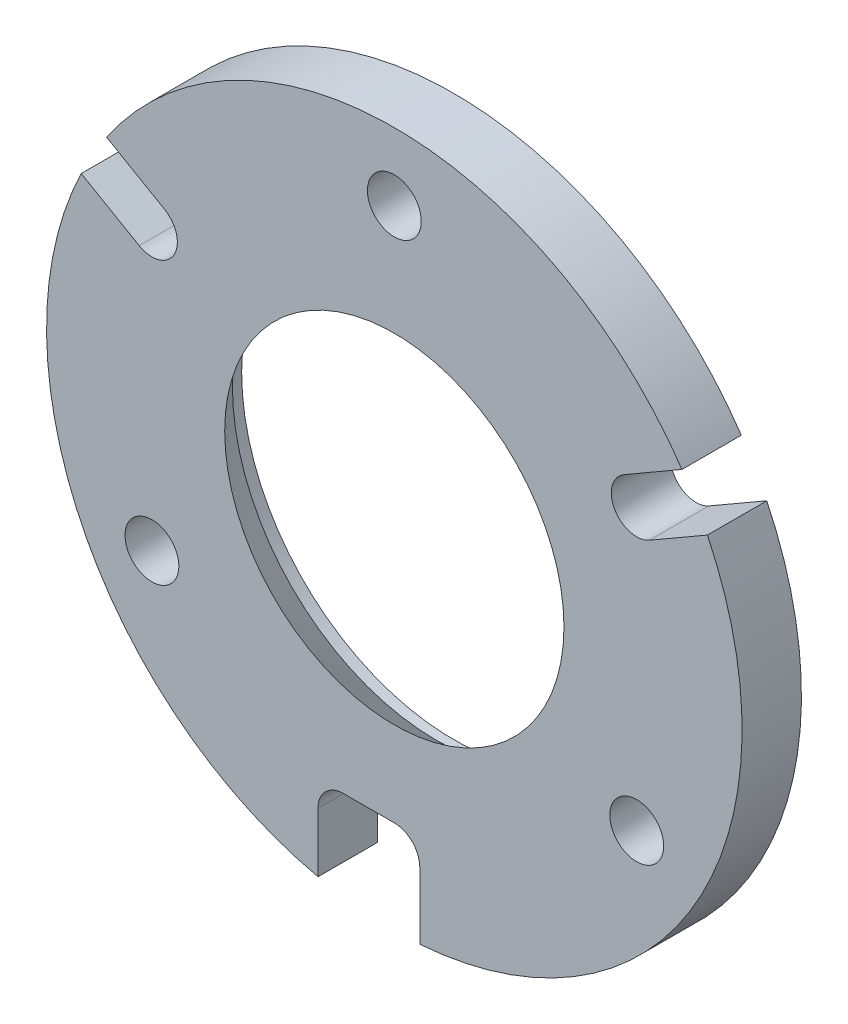
ISO-10303-21;
HEADER;
FILE_DESCRIPTION(('STEP AP214'),'2;1');
FILE_NAME('part.step','',(''),(''),'','','');
FILE_SCHEMA(('AUTOMOTIVE_DESIGN { 1 0 10303 214 1 1 1 1 }'));
ENDSEC;
DATA;
#1=APPLICATION_CONTEXT('core data for automotive mechanical design processes');
#2=APPLICATION_PROTOCOL_DEFINITION('international standard','automotive_design',2000,#1);
#3=PRODUCT_CONTEXT('',#1,'mechanical');
#4=PRODUCT('Part','Part','',(#3));
#5=PRODUCT_RELATED_PRODUCT_CATEGORY('part','',(#4));
#6=PRODUCT_DEFINITION_FORMATION('','',#4);
#7=PRODUCT_DEFINITION_CONTEXT('part definition',#1,'design');
#8=PRODUCT_DEFINITION('design','',#6,#7);
#9=PRODUCT_DEFINITION_SHAPE('','',#8);
#10=(LENGTH_UNIT() NAMED_UNIT(*) SI_UNIT(.MILLI.,.METRE.));
#11=(NAMED_UNIT(*) PLANE_ANGLE_UNIT() SI_UNIT($,.RADIAN.));
#12=(NAMED_UNIT(*) SI_UNIT($,.STERADIAN.) SOLID_ANGLE_UNIT());
#13=UNCERTAINTY_MEASURE_WITH_UNIT(LENGTH_MEASURE(1.E-05),#10,'distance_accuracy_value','');
#14=(GEOMETRIC_REPRESENTATION_CONTEXT(3) GLOBAL_UNCERTAINTY_ASSIGNED_CONTEXT((#13)) GLOBAL_UNIT_ASSIGNED_CONTEXT((#10,
#11,#12)) REPRESENTATION_CONTEXT('',''));
#15=CARTESIAN_POINT('',(0.,0.,0.));
#16=DIRECTION('',(0.,0.,1.));
#17=DIRECTION('',(1.,0.,0.));
#18=AXIS2_PLACEMENT_3D('',#15,#16,#17);
#19=CARTESIAN_POINT('',(0.,0.,5.));
#20=DIRECTION('',(0.,0.,-1.));
#21=DIRECTION('',(-1.,0.,0.));
#22=AXIS2_PLACEMENT_3D('',#19,#20,#21);
#23=CYLINDRICAL_SURFACE('',#22,12.5);
#24=CARTESIAN_POINT('',(0.,0.,1.5));
#25=DIRECTION('',(0.,0.,1.));
#26=DIRECTION('',(1.,0.,0.));
#27=AXIS2_PLACEMENT_3D('',#24,#25,#26);
#28=CIRCLE('',#27,12.5);
#29=CARTESIAN_POINT('',(12.5,0.,1.5));
#30=VERTEX_POINT('',#29);
#31=EDGE_CURVE('E206',#30,#30,#28,.T.);
#32=ORIENTED_EDGE('',*,*,#31,.F.);
#33=EDGE_LOOP('',(#32));
#34=FACE_BOUND('',#33,.T.);
#35=CARTESIAN_POINT('',(0.,0.,2.5));
#36=DIRECTION('',(0.,0.,-1.));
#37=DIRECTION('',(-1.,0.,0.));
#38=AXIS2_PLACEMENT_3D('',#35,#36,#37);
#39=CIRCLE('',#38,12.5);
#40=CARTESIAN_POINT('',(-12.5,0.,2.5));
#41=VERTEX_POINT('',#40);
#42=EDGE_CURVE('E209',#41,#41,#39,.T.);
#43=ORIENTED_EDGE('',*,*,#42,.F.);
#44=EDGE_LOOP('',(#43));
#45=FACE_BOUND('',#44,.T.);
#46=ADVANCED_FACE('F40',(#34,#45),#23,.F.);
#47=CARTESIAN_POINT('',(0.,0.,5.));
#48=DIRECTION('',(0.,0.,1.));
#49=DIRECTION('',(1.,0.,0.));
#50=AXIS2_PLACEMENT_3D('',#47,#48,#49);
#51=PLANE('',#50);
#52=DIRECTION('',(-1.,0.,0.));
#53=VECTOR('',#52,1.);
#54=CARTESIAN_POINT('',(0.,-15.,5.));
#55=LINE('',#54,#53);
#56=CARTESIAN_POINT('',(0.,-15.,5.));
#57=VERTEX_POINT('',#56);
#58=CARTESIAN_POINT('',(-3.,-15.,5.));
#59=VERTEX_POINT('',#58);
#60=EDGE_CURVE('E146',#57,#59,#55,.T.);
#61=ORIENTED_EDGE('',*,*,#60,.F.);
#62=CARTESIAN_POINT('',(0.,-16.5,5.));
#63=DIRECTION('',(0.,0.,1.));
#64=DIRECTION('',(1.,0.,0.));
#65=AXIS2_PLACEMENT_3D('',#62,#63,#64);
#66=CIRCLE('',#65,1.5);
#67=CARTESIAN_POINT('',(1.5,-16.5,5.));
#68=VERTEX_POINT('',#67);
#69=EDGE_CURVE('E249',#68,#57,#66,.T.);
#70=ORIENTED_EDGE('',*,*,#69,.F.);
#71=DIRECTION('',(0.,-1.,0.));
#72=VECTOR('',#71,1.);
#73=CARTESIAN_POINT('',(1.5,-45.2414213562373,5.));
#74=LINE('',#73,#72);
#75=CARTESIAN_POINT('',(1.5,-20.4450483002609,5.));
#76=VERTEX_POINT('',#75);
#77=EDGE_CURVE('E241',#68,#76,#74,.T.);
#78=ORIENTED_EDGE('',*,*,#77,.T.);
#79=CARTESIAN_POINT('',(0.,0.,5.));
#80=DIRECTION('',(0.,0.,1.));
#81=DIRECTION('',(1.,0.,0.));
#82=AXIS2_PLACEMENT_3D('',#79,#80,#81);
#83=CIRCLE('',#82,20.5);
#84=CARTESIAN_POINT('',(18.4559312096259,8.92348604445361,5.));
#85=VERTEX_POINT('',#84);
#86=EDGE_CURVE('E48',#76,#85,#83,.T.);
#87=ORIENTED_EDGE('',*,*,#86,.T.);
#88=DIRECTION('',(0.866025403784443,0.499999999999992,0.));
#89=VECTOR('',#88,1.);
#90=CARTESIAN_POINT('',(39.9302201978175,21.3216725724416,5.));
#91=LINE('',#90,#89);
#92=CARTESIAN_POINT('',(15.0394191624433,6.9509618943232,5.));
#93=VERTEX_POINT('',#92);
#94=EDGE_CURVE('E218',#93,#85,#91,.T.);
#95=ORIENTED_EDGE('',*,*,#94,.F.);
#96=CARTESIAN_POINT('',(14.2894191624433,8.24999999999987,5.));
#97=DIRECTION('',(0.,0.,1.));
#98=DIRECTION('',(-0.499999999999992,0.866025403784443,0.));
#99=AXIS2_PLACEMENT_3D('',#96,#97,#98);
#100=CIRCLE('',#99,1.5);
#101=CARTESIAN_POINT('',(13.5394191624433,9.54903810567653,5.));
#102=VERTEX_POINT('',#101);
#103=EDGE_CURVE('E215',#102,#93,#100,.T.);
#104=ORIENTED_EDGE('',*,*,#103,.F.);
#105=DIRECTION('',(0.866025403784443,0.499999999999992,0.));
#106=VECTOR('',#105,1.);
#107=CARTESIAN_POINT('',(38.4302201978176,23.919748783795,5.));
#108=LINE('',#107,#106);
#109=CARTESIAN_POINT('',(16.9559312096259,11.5215622558069,5.));
#110=VERTEX_POINT('',#109);
#111=EDGE_CURVE('E212',#102,#110,#108,.T.);
#112=ORIENTED_EDGE('',*,*,#111,.T.);
#113=CARTESIAN_POINT('',(-16.9559312096257,11.5215622558072,5.));
#114=VERTEX_POINT('',#113);
#115=EDGE_CURVE('E266',#110,#114,#83,.T.);
#116=ORIENTED_EDGE('',*,*,#115,.T.);
#117=DIRECTION('',(-0.866025403784436,0.500000000000004,0.));
#118=VECTOR('',#117,1.);
#119=CARTESIAN_POINT('',(-38.4302201978172,23.9197487837955,5.));
#120=LINE('',#119,#118);
#121=CARTESIAN_POINT('',(-13.5394191624432,9.54903810567672,5.));
#122=VERTEX_POINT('',#121);
#123=EDGE_CURVE('E235',#122,#114,#120,.T.);
#124=ORIENTED_EDGE('',*,*,#123,.F.);
#125=CARTESIAN_POINT('',(-14.2894191624432,8.25000000000007,5.));
#126=DIRECTION('',(0.,0.,1.));
#127=DIRECTION('',(-0.500000000000004,-0.866025403784436,0.));
#128=AXIS2_PLACEMENT_3D('',#125,#126,#127);
#129=CIRCLE('',#128,1.5);
#130=CARTESIAN_POINT('',(-15.0394191624432,6.95096189432341,5.));
#131=VERTEX_POINT('',#130);
#132=EDGE_CURVE('E232',#131,#122,#129,.T.);
#133=ORIENTED_EDGE('',*,*,#132,.F.);
#134=DIRECTION('',(-0.866025403784436,0.500000000000004,0.));
#135=VECTOR('',#134,1.);
#136=CARTESIAN_POINT('',(-39.9302201978172,21.3216725724422,5.));
#137=LINE('',#136,#135);
#138=CARTESIAN_POINT('',(-18.4559312096257,8.92348604445386,5.));
#139=VERTEX_POINT('',#138);
#140=EDGE_CURVE('E224',#131,#139,#137,.T.);
#141=ORIENTED_EDGE('',*,*,#140,.T.);
#142=CARTESIAN_POINT('',(-4.5,-20.,5.));
#143=VERTEX_POINT('',#142);
#144=EDGE_CURVE('E264',#139,#143,#83,.T.);
#145=ORIENTED_EDGE('',*,*,#144,.T.);
#146=DIRECTION('',(0.,-1.,0.));
#147=VECTOR('',#146,1.);
#148=CARTESIAN_POINT('',(-4.5,-45.183732205308,5.));
#149=LINE('',#148,#147);
#150=CARTESIAN_POINT('',(-4.5,-16.5,5.));
#151=VERTEX_POINT('',#150);
#152=EDGE_CURVE('E161',#151,#143,#149,.T.);
#153=ORIENTED_EDGE('',*,*,#152,.F.);
#154=CARTESIAN_POINT('',(-3.,-16.5,5.));
#155=DIRECTION('',(0.,0.,1.));
#156=DIRECTION('',(1.,0.,0.));
#157=AXIS2_PLACEMENT_3D('',#154,#155,#156);
#158=CIRCLE('',#157,1.5);
#159=EDGE_CURVE('E163',#59,#151,#158,.T.);
#160=ORIENTED_EDGE('',*,*,#159,.F.);
#161=EDGE_LOOP('',(#61,#70,#78,#87,#95,#104,#112,#116,#124,#133,#141,#145,#153,#160));
#162=FACE_BOUND('',#161,.T.);
#163=CARTESIAN_POINT('',(-14.2894191624432,-8.25,5.));
#164=DIRECTION('',(0.,0.,1.));
#165=DIRECTION('',(1.,0.,0.));
#166=AXIS2_PLACEMENT_3D('',#163,#164,#165);
#167=CIRCLE('',#166,1.5875);
#168=CARTESIAN_POINT('',(-12.7019191624432,-8.25,5.));
#169=VERTEX_POINT('',#168);
#170=EDGE_CURVE('E255',#169,#169,#167,.T.);
#171=ORIENTED_EDGE('',*,*,#170,.F.);
#172=EDGE_LOOP('',(#171));
#173=FACE_BOUND('',#172,.T.);
#174=CARTESIAN_POINT('',(0.,16.5,5.));
#175=DIRECTION('',(0.,0.,1.));
#176=DIRECTION('',(1.,0.,0.));
#177=AXIS2_PLACEMENT_3D('',#174,#175,#176);
#178=CIRCLE('',#177,1.5875);
#179=CARTESIAN_POINT('',(1.5875,16.5,5.));
#180=VERTEX_POINT('',#179);
#181=EDGE_CURVE('E262',#180,#180,#178,.T.);
#182=ORIENTED_EDGE('',*,*,#181,.F.);
#183=EDGE_LOOP('',(#182));
#184=FACE_BOUND('',#183,.T.);
#185=CARTESIAN_POINT('',(14.2894191624432,-8.25,5.));
#186=DIRECTION('',(0.,0.,1.));
#187=DIRECTION('',(1.,0.,0.));
#188=AXIS2_PLACEMENT_3D('',#185,#186,#187);
#189=CIRCLE('',#188,1.5875);
#190=CARTESIAN_POINT('',(15.8769191624432,-8.25,5.));
#191=VERTEX_POINT('',#190);
#192=EDGE_CURVE('E259',#191,#191,#189,.T.);
#193=ORIENTED_EDGE('',*,*,#192,.F.);
#194=EDGE_LOOP('',(#193));
#195=FACE_BOUND('',#194,.T.);
#196=CARTESIAN_POINT('',(0.,0.,5.));
#197=DIRECTION('',(0.,0.,-1.));
#198=DIRECTION('',(-1.,0.,0.));
#199=AXIS2_PLACEMENT_3D('',#196,#197,#198);
#200=CIRCLE('',#199,10.);
#201=CARTESIAN_POINT('',(-10.,0.,5.));
#202=VERTEX_POINT('',#201);
#203=EDGE_CURVE('E361',#202,#202,#200,.T.);
#204=ORIENTED_EDGE('',*,*,#203,.T.);
#205=EDGE_LOOP('',(#204));
#206=FACE_BOUND('',#205,.T.);
#207=ADVANCED_FACE('F274',(#162,#173,#184,#195,#206),#51,.T.);
#208=CARTESIAN_POINT('',(0.,0.,5.));
#209=DIRECTION('',(0.,0.,-1.));
#210=DIRECTION('',(-1.,0.,0.));
#211=AXIS2_PLACEMENT_3D('',#208,#209,#210);
#212=CYLINDRICAL_SURFACE('',#211,20.5);
#213=DIRECTION('',(0.,0.,1.));
#214=VECTOR('',#213,1.);
#215=CARTESIAN_POINT('',(16.9559312096259,11.5215622558069,0.));
#216=LINE('',#215,#214);
#217=CARTESIAN_POINT('',(16.9559312096259,11.5215622558069,1.5));
#218=VERTEX_POINT('',#217);
#219=EDGE_CURVE('E222',#218,#110,#216,.T.);
#220=ORIENTED_EDGE('',*,*,#219,.F.);
#221=CARTESIAN_POINT('',(0.,0.,1.5));
#222=DIRECTION('',(0.,0.,-1.));
#223=DIRECTION('',(-1.,0.,0.));
#224=AXIS2_PLACEMENT_3D('',#221,#222,#223);
#225=CIRCLE('',#224,20.5);
#226=CARTESIAN_POINT('',(-16.9559312096257,11.5215622558072,1.5));
#227=VERTEX_POINT('',#226);
#228=EDGE_CURVE('E181',#227,#218,#225,.T.);
#229=ORIENTED_EDGE('',*,*,#228,.F.);
#230=DIRECTION('',(0.,0.,1.));
#231=VECTOR('',#230,1.);
#232=CARTESIAN_POINT('',(-16.9559312096257,11.5215622558072,0.));
#233=LINE('',#232,#231);
#234=EDGE_CURVE('E242',#227,#114,#233,.T.);
#235=ORIENTED_EDGE('',*,*,#234,.T.);
#236=ORIENTED_EDGE('',*,*,#115,.F.);
#237=EDGE_LOOP('',(#220,#229,#235,#236));
#238=FACE_BOUND('',#237,.T.);
#239=ADVANCED_FACE('F298',(#238),#212,.T.);
#240=CARTESIAN_POINT('',(-4.5,-20.,1.5));
#241=VERTEX_POINT('',#240);
#242=CARTESIAN_POINT('',(-18.4559312096257,8.92348604445387,1.5));
#243=VERTEX_POINT('',#242);
#244=EDGE_CURVE('E174',#241,#243,#225,.T.);
#245=ORIENTED_EDGE('',*,*,#244,.F.);
#246=DIRECTION('',(0.,0.,1.));
#247=VECTOR('',#246,1.);
#248=CARTESIAN_POINT('',(-4.5,-20.,1.5));
#249=LINE('',#248,#247);
#250=EDGE_CURVE('E175',#241,#143,#249,.T.);
#251=ORIENTED_EDGE('',*,*,#250,.T.);
#252=ORIENTED_EDGE('',*,*,#144,.F.);
#253=DIRECTION('',(0.,0.,1.));
#254=VECTOR('',#253,1.);
#255=CARTESIAN_POINT('',(-18.4559312096257,8.92348604445386,0.));
#256=LINE('',#255,#254);
#257=EDGE_CURVE('E239',#243,#139,#256,.T.);
#258=ORIENTED_EDGE('',*,*,#257,.F.);
#259=EDGE_LOOP('',(#245,#251,#252,#258));
#260=FACE_BOUND('',#259,.T.);
#261=ADVANCED_FACE('F281',(#260),#212,.T.);
#262=DIRECTION('',(0.,0.,1.));
#263=VECTOR('',#262,1.);
#264=CARTESIAN_POINT('',(1.5,-20.4450483002609,0.));
#265=LINE('',#264,#263);
#266=CARTESIAN_POINT('',(1.5,-20.4450483002609,1.5));
#267=VERTEX_POINT('',#266);
#268=EDGE_CURVE('E253',#267,#76,#265,.T.);
#269=ORIENTED_EDGE('',*,*,#268,.F.);
#270=CARTESIAN_POINT('',(18.4559312096259,8.92348604445361,1.5));
#271=VERTEX_POINT('',#270);
#272=EDGE_CURVE('E180',#271,#267,#225,.T.);
#273=ORIENTED_EDGE('',*,*,#272,.F.);
#274=DIRECTION('',(0.,0.,1.));
#275=VECTOR('',#274,1.);
#276=CARTESIAN_POINT('',(18.4559312096259,8.92348604445361,0.));
#277=LINE('',#276,#275);
#278=EDGE_CURVE('E225',#271,#85,#277,.T.);
#279=ORIENTED_EDGE('',*,*,#278,.T.);
#280=ORIENTED_EDGE('',*,*,#86,.F.);
#281=EDGE_LOOP('',(#269,#273,#279,#280));
#282=FACE_BOUND('',#281,.T.);
#283=ADVANCED_FACE('F42',(#282),#212,.T.);
#284=CARTESIAN_POINT('',(0.,16.5,5.));
#285=DIRECTION('',(0.,0.,-1.));
#286=DIRECTION('',(-1.,0.,0.));
#287=AXIS2_PLACEMENT_3D('',#284,#285,#286);
#288=CYLINDRICAL_SURFACE('',#287,1.5875);
#289=CARTESIAN_POINT('',(0.,16.5,1.5));
#290=DIRECTION('',(0.,0.,1.));
#291=DIRECTION('',(1.,0.,0.));
#292=AXIS2_PLACEMENT_3D('',#289,#290,#291);
#293=CIRCLE('',#292,1.5875);
#294=CARTESIAN_POINT('',(1.5875,16.5,1.5));
#295=VERTEX_POINT('',#294);
#296=EDGE_CURVE('E203',#295,#295,#293,.T.);
#297=ORIENTED_EDGE('',*,*,#296,.F.);
#298=EDGE_LOOP('',(#297));
#299=FACE_BOUND('',#298,.T.);
#300=ORIENTED_EDGE('',*,*,#181,.T.);
#301=EDGE_LOOP('',(#300));
#302=FACE_BOUND('',#301,.T.);
#303=ADVANCED_FACE('F339',(#299,#302),#288,.F.);
#304=CARTESIAN_POINT('',(14.2894191624432,-8.25,5.));
#305=DIRECTION('',(0.,0.,-1.));
#306=DIRECTION('',(-1.,0.,0.));
#307=AXIS2_PLACEMENT_3D('',#304,#305,#306);
#308=CYLINDRICAL_SURFACE('',#307,1.5875);
#309=CARTESIAN_POINT('',(14.2894191624432,-8.25,1.5));
#310=DIRECTION('',(0.,0.,1.));
#311=DIRECTION('',(1.,0.,0.));
#312=AXIS2_PLACEMENT_3D('',#309,#310,#311);
#313=CIRCLE('',#312,1.5875);
#314=CARTESIAN_POINT('',(15.8769191624432,-8.25,1.5));
#315=VERTEX_POINT('',#314);
#316=EDGE_CURVE('E200',#315,#315,#313,.T.);
#317=ORIENTED_EDGE('',*,*,#316,.F.);
#318=EDGE_LOOP('',(#317));
#319=FACE_BOUND('',#318,.T.);
#320=ORIENTED_EDGE('',*,*,#192,.T.);
#321=EDGE_LOOP('',(#320));
#322=FACE_BOUND('',#321,.T.);
#323=ADVANCED_FACE('F342',(#319,#322),#308,.F.);
#324=CARTESIAN_POINT('',(-14.2894191624432,-8.25,5.));
#325=DIRECTION('',(0.,0.,-1.));
#326=DIRECTION('',(-1.,0.,0.));
#327=AXIS2_PLACEMENT_3D('',#324,#325,#326);
#328=CYLINDRICAL_SURFACE('',#327,1.5875);
#329=CARTESIAN_POINT('',(-14.2894191624432,-8.25,1.5));
#330=DIRECTION('',(0.,0.,1.));
#331=DIRECTION('',(1.,0.,0.));
#332=AXIS2_PLACEMENT_3D('',#329,#330,#331);
#333=CIRCLE('',#332,1.5875);
#334=CARTESIAN_POINT('',(-12.7019191624432,-8.25,1.5));
#335=VERTEX_POINT('',#334);
#336=EDGE_CURVE('E197',#335,#335,#333,.T.);
#337=ORIENTED_EDGE('',*,*,#336,.F.);
#338=EDGE_LOOP('',(#337));
#339=FACE_BOUND('',#338,.T.);
#340=ORIENTED_EDGE('',*,*,#170,.T.);
#341=EDGE_LOOP('',(#340));
#342=FACE_BOUND('',#341,.T.);
#343=ADVANCED_FACE('F328',(#339,#342),#328,.F.);
#344=CARTESIAN_POINT('',(1.5,-45.2414213562373,0.));
#345=DIRECTION('',(-1.,0.,0.));
#346=DIRECTION('',(0.,0.,1.));
#347=AXIS2_PLACEMENT_3D('',#344,#345,#346);
#348=PLANE('',#347);
#349=DIRECTION('',(0.,1.,0.));
#350=VECTOR('',#349,1.);
#351=CARTESIAN_POINT('',(1.5,-45.2414213562373,1.5));
#352=LINE('',#351,#350);
#353=CARTESIAN_POINT('',(1.5,-16.5,1.5));
#354=VERTEX_POINT('',#353);
#355=EDGE_CURVE('E195',#267,#354,#352,.T.);
#356=ORIENTED_EDGE('',*,*,#355,.F.);
#357=ORIENTED_EDGE('',*,*,#268,.T.);
#358=ORIENTED_EDGE('',*,*,#77,.F.);
#359=DIRECTION('',(0.,0.,1.));
#360=VECTOR('',#359,1.);
#361=CARTESIAN_POINT('',(1.5,-16.5,0.));
#362=LINE('',#361,#360);
#363=EDGE_CURVE('E252',#354,#68,#362,.T.);
#364=ORIENTED_EDGE('',*,*,#363,.F.);
#365=EDGE_LOOP('',(#356,#357,#358,#364));
#366=FACE_BOUND('',#365,.T.);
#367=ADVANCED_FACE('F316',(#366),#348,.T.);
#368=CARTESIAN_POINT('',(0.,-16.5,0.));
#369=DIRECTION('',(0.,0.,1.));
#370=DIRECTION('',(1.,0.,0.));
#371=AXIS2_PLACEMENT_3D('',#368,#369,#370);
#372=CYLINDRICAL_SURFACE('',#371,1.5);
#373=ORIENTED_EDGE('',*,*,#69,.T.);
#374=DIRECTION('',(0.,0.,1.));
#375=VECTOR('',#374,1.);
#376=CARTESIAN_POINT('',(0.,-15.,1.5));
#377=LINE('',#376,#375);
#378=CARTESIAN_POINT('',(0.,-15.,1.5));
#379=VERTEX_POINT('',#378);
#380=EDGE_CURVE('E172',#379,#57,#377,.T.);
#381=ORIENTED_EDGE('',*,*,#380,.F.);
#382=CARTESIAN_POINT('',(0.,-16.5,1.5));
#383=DIRECTION('',(0.,0.,1.));
#384=DIRECTION('',(1.,0.,0.));
#385=AXIS2_PLACEMENT_3D('',#382,#383,#384);
#386=CIRCLE('',#385,1.5);
#387=EDGE_CURVE('E160',#379,#354,#386,.F.);
#388=ORIENTED_EDGE('',*,*,#387,.T.);
#389=ORIENTED_EDGE('',*,*,#363,.T.);
#390=EDGE_LOOP('',(#373,#381,#388,#389));
#391=FACE_BOUND('',#390,.T.);
#392=ADVANCED_FACE('F320',(#391),#372,.F.);
#393=CARTESIAN_POINT('',(-39.9302201978172,21.3216725724422,0.));
#394=DIRECTION('',(0.500000000000004,0.866025403784436,0.));
#395=DIRECTION('',(-0.866025403784436,0.500000000000004,0.));
#396=AXIS2_PLACEMENT_3D('',#393,#394,#395);
#397=PLANE('',#396);
#398=DIRECTION('',(0.866025403784436,-0.500000000000004,0.));
#399=VECTOR('',#398,1.);
#400=CARTESIAN_POINT('',(-39.9302201978172,21.3216725724422,1.50000000000001));
#401=LINE('',#400,#399);
#402=CARTESIAN_POINT('',(-15.0394191624432,6.95096189432341,1.5));
#403=VERTEX_POINT('',#402);
#404=EDGE_CURVE('E192',#243,#403,#401,.T.);
#405=ORIENTED_EDGE('',*,*,#404,.F.);
#406=ORIENTED_EDGE('',*,*,#257,.T.);
#407=ORIENTED_EDGE('',*,*,#140,.F.);
#408=DIRECTION('',(0.,0.,1.));
#409=VECTOR('',#408,1.);
#410=CARTESIAN_POINT('',(-15.0394191624432,6.95096189432341,0.));
#411=LINE('',#410,#409);
#412=EDGE_CURVE('E238',#403,#131,#411,.T.);
#413=ORIENTED_EDGE('',*,*,#412,.F.);
#414=EDGE_LOOP('',(#405,#406,#407,#413));
#415=FACE_BOUND('',#414,.T.);
#416=ADVANCED_FACE('F286',(#415),#397,.T.);
#417=CARTESIAN_POINT('',(-38.4302201978172,23.9197487837955,0.));
#418=DIRECTION('',(0.500000000000004,0.866025403784436,0.));
#419=DIRECTION('',(-0.866025403784436,0.500000000000004,0.));
#420=AXIS2_PLACEMENT_3D('',#417,#418,#419);
#421=PLANE('',#420);
#422=ORIENTED_EDGE('',*,*,#234,.F.);
#423=DIRECTION('',(0.866025403784436,-0.500000000000004,0.));
#424=VECTOR('',#423,1.);
#425=CARTESIAN_POINT('',(-38.4302201978172,23.9197487837955,1.5));
#426=LINE('',#425,#424);
#427=CARTESIAN_POINT('',(-13.5394191624432,9.54903810567672,1.5));
#428=VERTEX_POINT('',#427);
#429=EDGE_CURVE('E189',#227,#428,#426,.T.);
#430=ORIENTED_EDGE('',*,*,#429,.T.);
#431=DIRECTION('',(0.,0.,1.));
#432=VECTOR('',#431,1.);
#433=CARTESIAN_POINT('',(-13.5394191624432,9.54903810567672,0.));
#434=LINE('',#433,#432);
#435=EDGE_CURVE('E244',#428,#122,#434,.T.);
#436=ORIENTED_EDGE('',*,*,#435,.T.);
#437=ORIENTED_EDGE('',*,*,#123,.T.);
#438=EDGE_LOOP('',(#422,#430,#436,#437));
#439=FACE_BOUND('',#438,.T.);
#440=ADVANCED_FACE('F294',(#439),#421,.F.);
#441=CARTESIAN_POINT('',(-14.2894191624432,8.25000000000007,0.));
#442=DIRECTION('',(0.,0.,1.));
#443=DIRECTION('',(1.,0.,0.));
#444=AXIS2_PLACEMENT_3D('',#441,#442,#443);
#445=CYLINDRICAL_SURFACE('',#444,1.5);
#446=ORIENTED_EDGE('',*,*,#435,.F.);
#447=CARTESIAN_POINT('',(-14.2894191624432,8.25000000000007,1.5));
#448=DIRECTION('',(0.,0.,1.));
#449=DIRECTION('',(1.,0.,0.));
#450=AXIS2_PLACEMENT_3D('',#447,#448,#449);
#451=CIRCLE('',#450,1.5);
#452=EDGE_CURVE('E186',#428,#403,#451,.F.);
#453=ORIENTED_EDGE('',*,*,#452,.T.);
#454=ORIENTED_EDGE('',*,*,#412,.T.);
#455=ORIENTED_EDGE('',*,*,#132,.T.);
#456=EDGE_LOOP('',(#446,#453,#454,#455));
#457=FACE_BOUND('',#456,.T.);
#458=ADVANCED_FACE('F289',(#457),#445,.F.);
#459=CARTESIAN_POINT('',(38.4302201978176,23.919748783795,0.));
#460=DIRECTION('',(0.499999999999992,-0.866025403784443,0.));
#461=DIRECTION('',(0.866025403784443,0.499999999999992,0.));
#462=AXIS2_PLACEMENT_3D('',#459,#460,#461);
#463=PLANE('',#462);
#464=DIRECTION('',(-0.866025403784443,-0.499999999999992,0.));
#465=VECTOR('',#464,1.);
#466=CARTESIAN_POINT('',(38.4302201978176,23.919748783795,1.5));
#467=LINE('',#466,#465);
#468=CARTESIAN_POINT('',(13.5394191624433,9.54903810567653,1.5));
#469=VERTEX_POINT('',#468);
#470=EDGE_CURVE('E63',#218,#469,#467,.T.);
#471=ORIENTED_EDGE('',*,*,#470,.F.);
#472=ORIENTED_EDGE('',*,*,#219,.T.);
#473=ORIENTED_EDGE('',*,*,#111,.F.);
#474=DIRECTION('',(0.,0.,1.));
#475=VECTOR('',#474,1.);
#476=CARTESIAN_POINT('',(13.5394191624433,9.54903810567653,0.));
#477=LINE('',#476,#475);
#478=EDGE_CURVE('E221',#469,#102,#477,.T.);
#479=ORIENTED_EDGE('',*,*,#478,.F.);
#480=EDGE_LOOP('',(#471,#472,#473,#479));
#481=FACE_BOUND('',#480,.T.);
#482=ADVANCED_FACE('F303',(#481),#463,.T.);
#483=CARTESIAN_POINT('',(39.9302201978175,21.3216725724416,0.));
#484=DIRECTION('',(0.499999999999992,-0.866025403784443,0.));
#485=DIRECTION('',(0.866025403784443,0.499999999999992,0.));
#486=AXIS2_PLACEMENT_3D('',#483,#484,#485);
#487=PLANE('',#486);
#488=ORIENTED_EDGE('',*,*,#278,.F.);
#489=DIRECTION('',(-0.866025403784443,-0.499999999999992,0.));
#490=VECTOR('',#489,1.);
#491=CARTESIAN_POINT('',(39.9302201978175,21.3216725724416,1.5));
#492=LINE('',#491,#490);
#493=CARTESIAN_POINT('',(15.0394191624433,6.9509618943232,1.5));
#494=VERTEX_POINT('',#493);
#495=EDGE_CURVE('E182',#271,#494,#492,.T.);
#496=ORIENTED_EDGE('',*,*,#495,.T.);
#497=DIRECTION('',(0.,0.,1.));
#498=VECTOR('',#497,1.);
#499=CARTESIAN_POINT('',(15.0394191624433,6.9509618943232,0.));
#500=LINE('',#499,#498);
#501=EDGE_CURVE('E227',#494,#93,#500,.T.);
#502=ORIENTED_EDGE('',*,*,#501,.T.);
#503=ORIENTED_EDGE('',*,*,#94,.T.);
#504=EDGE_LOOP('',(#488,#496,#502,#503));
#505=FACE_BOUND('',#504,.T.);
#506=ADVANCED_FACE('F310',(#505),#487,.F.);
#507=CARTESIAN_POINT('',(14.2894191624433,8.24999999999987,0.));
#508=DIRECTION('',(0.,0.,1.));
#509=DIRECTION('',(1.,0.,0.));
#510=AXIS2_PLACEMENT_3D('',#507,#508,#509);
#511=CYLINDRICAL_SURFACE('',#510,1.5);
#512=ORIENTED_EDGE('',*,*,#501,.F.);
#513=CARTESIAN_POINT('',(14.2894191624433,8.24999999999987,1.5));
#514=DIRECTION('',(0.,0.,1.));
#515=DIRECTION('',(1.,0.,0.));
#516=AXIS2_PLACEMENT_3D('',#513,#514,#515);
#517=CIRCLE('',#516,1.5);
#518=EDGE_CURVE('E11',#494,#469,#517,.F.);
#519=ORIENTED_EDGE('',*,*,#518,.T.);
#520=ORIENTED_EDGE('',*,*,#478,.T.);
#521=ORIENTED_EDGE('',*,*,#103,.T.);
#522=EDGE_LOOP('',(#512,#519,#520,#521));
#523=FACE_BOUND('',#522,.T.);
#524=ADVANCED_FACE('F306',(#523),#511,.F.);
#525=CARTESIAN_POINT('',(-16.8631093768002,0.,2.5));
#526=DIRECTION('',(0.,0.,1.));
#527=DIRECTION('',(1.,0.,0.));
#528=AXIS2_PLACEMENT_3D('',#525,#526,#527);
#529=PLANE('',#528);
#530=CARTESIAN_POINT('',(0.,0.,2.5));
#531=DIRECTION('',(0.,0.,-1.));
#532=DIRECTION('',(-1.,0.,0.));
#533=AXIS2_PLACEMENT_3D('',#530,#531,#532);
#534=CIRCLE('',#533,12.0453483654876);
#535=CARTESIAN_POINT('',(-12.0453483654876,0.,2.5));
#536=VERTEX_POINT('',#535);
#537=EDGE_CURVE('E166',#536,#536,#534,.T.);
#538=ORIENTED_EDGE('',*,*,#537,.F.);
#539=EDGE_LOOP('',(#538));
#540=FACE_BOUND('',#539,.T.);
#541=ORIENTED_EDGE('',*,*,#42,.T.);
#542=EDGE_LOOP('',(#541));
#543=FACE_BOUND('',#542,.T.);
#544=ADVANCED_FACE('F368',(#540,#543),#529,.F.);
#545=CARTESIAN_POINT('',(0.,0.,1.5));
#546=DIRECTION('',(0.,0.,1.));
#547=DIRECTION('',(1.,0.,0.));
#548=AXIS2_PLACEMENT_3D('',#545,#546,#547);
#549=PLANE('',#548);
#550=ORIENTED_EDGE('',*,*,#387,.F.);
#551=DIRECTION('',(-1.,0.,0.));
#552=VECTOR('',#551,1.);
#553=CARTESIAN_POINT('',(0.,-15.,1.5));
#554=LINE('',#553,#552);
#555=CARTESIAN_POINT('',(-3.,-15.,1.5));
#556=VERTEX_POINT('',#555);
#557=EDGE_CURVE('E143',#379,#556,#554,.T.);
#558=ORIENTED_EDGE('',*,*,#557,.T.);
#559=CARTESIAN_POINT('',(-3.,-16.5,1.5));
#560=DIRECTION('',(0.,0.,1.));
#561=DIRECTION('',(1.,0.,0.));
#562=AXIS2_PLACEMENT_3D('',#559,#560,#561);
#563=CIRCLE('',#562,1.5);
#564=CARTESIAN_POINT('',(-4.5,-16.5,1.5));
#565=VERTEX_POINT('',#564);
#566=EDGE_CURVE('E153',#556,#565,#563,.T.);
#567=ORIENTED_EDGE('',*,*,#566,.T.);
#568=DIRECTION('',(0.,-1.,0.));
#569=VECTOR('',#568,1.);
#570=CARTESIAN_POINT('',(-4.5,-45.183732205308,1.5));
#571=LINE('',#570,#569);
#572=EDGE_CURVE('E55',#565,#241,#571,.T.);
#573=ORIENTED_EDGE('',*,*,#572,.T.);
#574=ORIENTED_EDGE('',*,*,#244,.T.);
#575=ORIENTED_EDGE('',*,*,#404,.T.);
#576=ORIENTED_EDGE('',*,*,#452,.F.);
#577=ORIENTED_EDGE('',*,*,#429,.F.);
#578=ORIENTED_EDGE('',*,*,#228,.T.);
#579=ORIENTED_EDGE('',*,*,#470,.T.);
#580=ORIENTED_EDGE('',*,*,#518,.F.);
#581=ORIENTED_EDGE('',*,*,#495,.F.);
#582=ORIENTED_EDGE('',*,*,#272,.T.);
#583=ORIENTED_EDGE('',*,*,#355,.T.);
#584=EDGE_LOOP('',(#550,#558,#567,#573,#574,#575,#576,#577,#578,#579,#580,#581,#582,#583));
#585=FACE_BOUND('',#584,.T.);
#586=ORIENTED_EDGE('',*,*,#31,.T.);
#587=EDGE_LOOP('',(#586));
#588=FACE_BOUND('',#587,.T.);
#589=ORIENTED_EDGE('',*,*,#296,.T.);
#590=EDGE_LOOP('',(#589));
#591=FACE_BOUND('',#590,.T.);
#592=ORIENTED_EDGE('',*,*,#316,.T.);
#593=EDGE_LOOP('',(#592));
#594=FACE_BOUND('',#593,.T.);
#595=ORIENTED_EDGE('',*,*,#336,.T.);
#596=EDGE_LOOP('',(#595));
#597=FACE_BOUND('',#596,.T.);
#598=ADVANCED_FACE('F157',(#585,#588,#591,#594,#597),#549,.F.);
#599=CARTESIAN_POINT('',(0.,-15.,1.5));
#600=DIRECTION('',(0.,1.,0.));
#601=DIRECTION('',(0.,0.,1.));
#602=AXIS2_PLACEMENT_3D('',#599,#600,#601);
#603=PLANE('',#602);
#604=ORIENTED_EDGE('',*,*,#60,.T.);
#605=DIRECTION('',(0.,0.,1.));
#606=VECTOR('',#605,1.);
#607=CARTESIAN_POINT('',(-3.,-15.,1.5));
#608=LINE('',#607,#606);
#609=EDGE_CURVE('E139',#556,#59,#608,.T.);
#610=ORIENTED_EDGE('',*,*,#609,.F.);
#611=ORIENTED_EDGE('',*,*,#557,.F.);
#612=ORIENTED_EDGE('',*,*,#380,.T.);
#613=EDGE_LOOP('',(#604,#610,#611,#612));
#614=FACE_BOUND('',#613,.T.);
#615=ADVANCED_FACE('F141',(#614),#603,.F.);
#616=CARTESIAN_POINT('',(-4.5,-45.183732205308,1.5));
#617=DIRECTION('',(-1.,0.,0.));
#618=DIRECTION('',(0.,0.,1.));
#619=AXIS2_PLACEMENT_3D('',#616,#617,#618);
#620=PLANE('',#619);
#621=ORIENTED_EDGE('',*,*,#152,.T.);
#622=ORIENTED_EDGE('',*,*,#250,.F.);
#623=ORIENTED_EDGE('',*,*,#572,.F.);
#624=DIRECTION('',(0.,0.,1.));
#625=VECTOR('',#624,1.);
#626=CARTESIAN_POINT('',(-4.5,-16.5,1.5));
#627=LINE('',#626,#625);
#628=EDGE_CURVE('E150',#565,#151,#627,.T.);
#629=ORIENTED_EDGE('',*,*,#628,.T.);
#630=EDGE_LOOP('',(#621,#622,#623,#629));
#631=FACE_BOUND('',#630,.T.);
#632=ADVANCED_FACE('F282',(#631),#620,.F.);
#633=CARTESIAN_POINT('',(-3.,-16.5,1.5));
#634=DIRECTION('',(0.,0.,1.));
#635=DIRECTION('',(1.,0.,0.));
#636=AXIS2_PLACEMENT_3D('',#633,#634,#635);
#637=CYLINDRICAL_SURFACE('',#636,1.5);
#638=ORIENTED_EDGE('',*,*,#159,.T.);
#639=ORIENTED_EDGE('',*,*,#628,.F.);
#640=ORIENTED_EDGE('',*,*,#566,.F.);
#641=ORIENTED_EDGE('',*,*,#609,.T.);
#642=EDGE_LOOP('',(#638,#639,#640,#641));
#643=FACE_BOUND('',#642,.T.);
#644=ADVANCED_FACE('F154',(#643),#637,.F.);
#645=CARTESIAN_POINT('',(0.,0.,2.5));
#646=DIRECTION('',(0.,0.,-1.));
#647=DIRECTION('',(-1.,0.,0.));
#648=AXIS2_PLACEMENT_3D('',#645,#646,#647);
#649=CONICAL_SURFACE('',#648,12.0453483654876,0.685704069236105);
#650=ORIENTED_EDGE('',*,*,#203,.F.);
#651=EDGE_LOOP('',(#650));
#652=FACE_BOUND('',#651,.T.);
#653=ORIENTED_EDGE('',*,*,#537,.T.);
#654=EDGE_LOOP('',(#653));
#655=FACE_BOUND('',#654,.T.);
#656=ADVANCED_FACE('F366',(#652,#655),#649,.F.);
#657=CLOSED_SHELL('',(#46,#207,#239,#261,#283,#303,#323,#343,#367,#392,#416,#440,#458,#482,#506,
#524,#544,#598,#615,#632,#644,#656));
#658=MANIFOLD_SOLID_BREP('B2',#657);
#659=ADVANCED_BREP_SHAPE_REPRESENTATION('',(#18,#658),#14);
#660=SHAPE_DEFINITION_REPRESENTATION(#9,#659);
ENDSEC;
END-ISO-10303-21;
